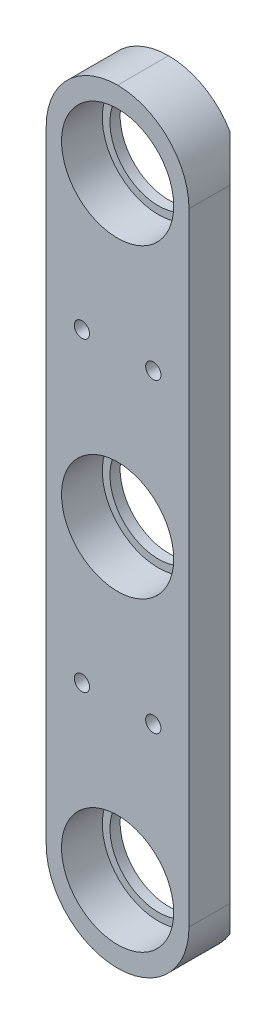
ISO-10303-21;
HEADER;
FILE_DESCRIPTION(('STEP AP214'),'2;1');
FILE_NAME('part.step','',(''),(''),'','','');
FILE_SCHEMA(('AUTOMOTIVE_DESIGN { 1 0 10303 214 1 1 1 1 }'));
ENDSEC;
DATA;
#1=APPLICATION_CONTEXT('core data for automotive mechanical design processes');
#2=APPLICATION_PROTOCOL_DEFINITION('international standard','automotive_design',2000,#1);
#3=PRODUCT_CONTEXT('',#1,'mechanical');
#4=PRODUCT('Part','Part','',(#3));
#5=PRODUCT_RELATED_PRODUCT_CATEGORY('part','',(#4));
#6=PRODUCT_DEFINITION_FORMATION('','',#4);
#7=PRODUCT_DEFINITION_CONTEXT('part definition',#1,'design');
#8=PRODUCT_DEFINITION('design','',#6,#7);
#9=PRODUCT_DEFINITION_SHAPE('','',#8);
#10=(LENGTH_UNIT() NAMED_UNIT(*) SI_UNIT(.MILLI.,.METRE.));
#11=(NAMED_UNIT(*) PLANE_ANGLE_UNIT() SI_UNIT($,.RADIAN.));
#12=(NAMED_UNIT(*) SI_UNIT($,.STERADIAN.) SOLID_ANGLE_UNIT());
#13=UNCERTAINTY_MEASURE_WITH_UNIT(LENGTH_MEASURE(1.E-05),#10,'distance_accuracy_value','');
#14=(GEOMETRIC_REPRESENTATION_CONTEXT(3) GLOBAL_UNCERTAINTY_ASSIGNED_CONTEXT((#13)) GLOBAL_UNIT_ASSIGNED_CONTEXT((#10,
#11,#12)) REPRESENTATION_CONTEXT('',''));
#15=CARTESIAN_POINT('',(0.,0.,0.));
#16=DIRECTION('',(0.,0.,1.));
#17=DIRECTION('',(1.,0.,0.));
#18=AXIS2_PLACEMENT_3D('',#15,#16,#17);
#19=CARTESIAN_POINT('',(0.,0.,10.));
#20=DIRECTION('',(0.,0.,-1.));
#21=DIRECTION('',(-1.,0.,0.));
#22=AXIS2_PLACEMENT_3D('',#19,#20,#21);
#23=PLANE('',#22);
#24=CARTESIAN_POINT('',(-7.,-30.,10.));
#25=DIRECTION('',(0.,0.,1.));
#26=DIRECTION('',(-1.,0.,0.));
#27=AXIS2_PLACEMENT_3D('',#24,#25,#26);
#28=CIRCLE('',#27,1.5);
#29=CARTESIAN_POINT('',(-8.5,-30.,10.));
#30=VERTEX_POINT('',#29);
#31=EDGE_CURVE('E188',#30,#30,#28,.T.);
#32=ORIENTED_EDGE('',*,*,#31,.F.);
#33=EDGE_LOOP('',(#32));
#34=FACE_BOUND('',#33,.T.);
#35=CARTESIAN_POINT('',(7.,-30.,10.));
#36=DIRECTION('',(0.,0.,1.));
#37=DIRECTION('',(1.,0.,0.));
#38=AXIS2_PLACEMENT_3D('',#35,#36,#37);
#39=CIRCLE('',#38,1.5);
#40=CARTESIAN_POINT('',(8.5,-30.,10.));
#41=VERTEX_POINT('',#40);
#42=EDGE_CURVE('E297',#41,#41,#39,.T.);
#43=ORIENTED_EDGE('',*,*,#42,.F.);
#44=EDGE_LOOP('',(#43));
#45=FACE_BOUND('',#44,.T.);
#46=CARTESIAN_POINT('',(7.,30.,10.));
#47=DIRECTION('',(0.,0.,1.));
#48=DIRECTION('',(-1.,0.,0.));
#49=AXIS2_PLACEMENT_3D('',#46,#47,#48);
#50=CIRCLE('',#49,1.5);
#51=CARTESIAN_POINT('',(5.5,30.,10.));
#52=VERTEX_POINT('',#51);
#53=EDGE_CURVE('E295',#52,#52,#50,.T.);
#54=ORIENTED_EDGE('',*,*,#53,.F.);
#55=EDGE_LOOP('',(#54));
#56=FACE_BOUND('',#55,.T.);
#57=CARTESIAN_POINT('',(-7.,30.,10.));
#58=DIRECTION('',(0.,0.,1.));
#59=DIRECTION('',(1.,0.,0.));
#60=AXIS2_PLACEMENT_3D('',#57,#58,#59);
#61=CIRCLE('',#60,1.5);
#62=CARTESIAN_POINT('',(-5.5,30.,10.));
#63=VERTEX_POINT('',#62);
#64=EDGE_CURVE('E176',#63,#63,#61,.T.);
#65=ORIENTED_EDGE('',*,*,#64,.F.);
#66=EDGE_LOOP('',(#65));
#67=FACE_BOUND('',#66,.T.);
#68=DIRECTION('',(0.,1.,0.));
#69=VECTOR('',#68,1.);
#70=CARTESIAN_POINT('',(14.,75.,10.));
#71=LINE('',#70,#69);
#72=CARTESIAN_POINT('',(14.,-61.,10.));
#73=VERTEX_POINT('',#72);
#74=CARTESIAN_POINT('',(14.,61.,10.));
#75=VERTEX_POINT('',#74);
#76=EDGE_CURVE('E150',#73,#75,#71,.T.);
#77=ORIENTED_EDGE('',*,*,#76,.T.);
#78=CARTESIAN_POINT('',(0.,61.,10.));
#79=DIRECTION('',(0.,0.,-1.));
#80=DIRECTION('',(-1.,0.,0.));
#81=AXIS2_PLACEMENT_3D('',#78,#79,#80);
#82=CIRCLE('',#81,14.);
#83=CARTESIAN_POINT('',(0.,75.,10.));
#84=VERTEX_POINT('',#83);
#85=EDGE_CURVE('E142',#75,#84,#82,.F.);
#86=ORIENTED_EDGE('',*,*,#85,.T.);
#87=CARTESIAN_POINT('',(0.,61.,10.));
#88=DIRECTION('',(0.,0.,-1.));
#89=DIRECTION('',(-1.,0.,0.));
#90=AXIS2_PLACEMENT_3D('',#87,#88,#89);
#91=CIRCLE('',#90,14.);
#92=CARTESIAN_POINT('',(-14.,61.,10.));
#93=VERTEX_POINT('',#92);
#94=EDGE_CURVE('E66',#84,#93,#91,.F.);
#95=ORIENTED_EDGE('',*,*,#94,.T.);
#96=DIRECTION('',(0.,-1.,0.));
#97=VECTOR('',#96,1.);
#98=CARTESIAN_POINT('',(-14.,75.,10.));
#99=LINE('',#98,#97);
#100=CARTESIAN_POINT('',(-14.,-61.,10.));
#101=VERTEX_POINT('',#100);
#102=EDGE_CURVE('E217',#93,#101,#99,.T.);
#103=ORIENTED_EDGE('',*,*,#102,.T.);
#104=CARTESIAN_POINT('',(0.,-61.,10.));
#105=DIRECTION('',(0.,0.,-1.));
#106=DIRECTION('',(-1.,0.,0.));
#107=AXIS2_PLACEMENT_3D('',#104,#105,#106);
#108=CIRCLE('',#107,14.);
#109=CARTESIAN_POINT('',(0.,-75.,10.));
#110=VERTEX_POINT('',#109);
#111=EDGE_CURVE('E137',#101,#110,#108,.F.);
#112=ORIENTED_EDGE('',*,*,#111,.T.);
#113=CARTESIAN_POINT('',(0.,-61.,10.));
#114=DIRECTION('',(0.,0.,-1.));
#115=DIRECTION('',(-1.,0.,0.));
#116=AXIS2_PLACEMENT_3D('',#113,#114,#115);
#117=CIRCLE('',#116,14.);
#118=EDGE_CURVE('E138',#110,#73,#117,.F.);
#119=ORIENTED_EDGE('',*,*,#118,.T.);
#120=EDGE_LOOP('',(#77,#86,#95,#103,#112,#119));
#121=FACE_BOUND('',#120,.T.);
#122=CARTESIAN_POINT('',(0.,0.,10.));
#123=DIRECTION('',(0.,0.,1.));
#124=DIRECTION('',(1.,0.,0.));
#125=AXIS2_PLACEMENT_3D('',#122,#123,#124);
#126=CIRCLE('',#125,11.);
#127=CARTESIAN_POINT('',(11.,0.,10.));
#128=VERTEX_POINT('',#127);
#129=EDGE_CURVE('E212',#128,#128,#126,.T.);
#130=ORIENTED_EDGE('',*,*,#129,.F.);
#131=EDGE_LOOP('',(#130));
#132=FACE_BOUND('',#131,.T.);
#133=CARTESIAN_POINT('',(0.,60.,10.));
#134=DIRECTION('',(0.,0.,1.));
#135=DIRECTION('',(1.,0.,0.));
#136=AXIS2_PLACEMENT_3D('',#133,#134,#135);
#137=CIRCLE('',#136,11.);
#138=CARTESIAN_POINT('',(11.,60.,10.));
#139=VERTEX_POINT('',#138);
#140=EDGE_CURVE('E211',#139,#139,#137,.T.);
#141=ORIENTED_EDGE('',*,*,#140,.F.);
#142=EDGE_LOOP('',(#141));
#143=FACE_BOUND('',#142,.T.);
#144=CARTESIAN_POINT('',(4.18977760661176E-13,-60.,10.));
#145=DIRECTION('',(0.,0.,1.));
#146=DIRECTION('',(1.,0.,0.));
#147=AXIS2_PLACEMENT_3D('',#144,#145,#146);
#148=CIRCLE('',#147,11.);
#149=CARTESIAN_POINT('',(11.0000000000004,-60.,10.));
#150=VERTEX_POINT('',#149);
#151=EDGE_CURVE('E204',#150,#150,#148,.T.);
#152=ORIENTED_EDGE('',*,*,#151,.F.);
#153=EDGE_LOOP('',(#152));
#154=FACE_BOUND('',#153,.T.);
#155=ADVANCED_FACE('F43',(#34,#45,#56,#67,#121,#132,#143,#154),#23,.F.);
#156=CARTESIAN_POINT('',(0.,0.,0.));
#157=DIRECTION('',(0.,0.,-1.));
#158=DIRECTION('',(-1.,0.,0.));
#159=AXIS2_PLACEMENT_3D('',#156,#157,#158);
#160=PLANE('',#159);
#161=CARTESIAN_POINT('',(-7.,-30.,0.));
#162=DIRECTION('',(0.,0.,-1.));
#163=DIRECTION('',(-1.,0.,0.));
#164=AXIS2_PLACEMENT_3D('',#161,#162,#163);
#165=CIRCLE('',#164,1.5);
#166=CARTESIAN_POINT('',(-8.5,-30.,0.));
#167=VERTEX_POINT('',#166);
#168=EDGE_CURVE('E302',#167,#167,#165,.F.);
#169=ORIENTED_EDGE('',*,*,#168,.T.);
#170=EDGE_LOOP('',(#169));
#171=FACE_BOUND('',#170,.T.);
#172=CARTESIAN_POINT('',(7.,-30.,0.));
#173=DIRECTION('',(0.,0.,-1.));
#174=DIRECTION('',(-1.,0.,0.));
#175=AXIS2_PLACEMENT_3D('',#172,#173,#174);
#176=CIRCLE('',#175,1.5);
#177=CARTESIAN_POINT('',(5.5,-30.,0.));
#178=VERTEX_POINT('',#177);
#179=EDGE_CURVE('E294',#178,#178,#176,.F.);
#180=ORIENTED_EDGE('',*,*,#179,.T.);
#181=EDGE_LOOP('',(#180));
#182=FACE_BOUND('',#181,.T.);
#183=CARTESIAN_POINT('',(7.,30.,0.));
#184=DIRECTION('',(0.,0.,-1.));
#185=DIRECTION('',(-1.,0.,0.));
#186=AXIS2_PLACEMENT_3D('',#183,#184,#185);
#187=CIRCLE('',#186,1.5);
#188=CARTESIAN_POINT('',(5.5,30.,0.));
#189=VERTEX_POINT('',#188);
#190=EDGE_CURVE('E181',#189,#189,#187,.F.);
#191=ORIENTED_EDGE('',*,*,#190,.T.);
#192=EDGE_LOOP('',(#191));
#193=FACE_BOUND('',#192,.T.);
#194=CARTESIAN_POINT('',(-7.,30.,0.));
#195=DIRECTION('',(0.,0.,-1.));
#196=DIRECTION('',(-1.,0.,0.));
#197=AXIS2_PLACEMENT_3D('',#194,#195,#196);
#198=CIRCLE('',#197,1.5);
#199=CARTESIAN_POINT('',(-8.5,30.,0.));
#200=VERTEX_POINT('',#199);
#201=EDGE_CURVE('E179',#200,#200,#198,.F.);
#202=ORIENTED_EDGE('',*,*,#201,.T.);
#203=EDGE_LOOP('',(#202));
#204=FACE_BOUND('',#203,.T.);
#205=CARTESIAN_POINT('',(0.,61.,0.));
#206=DIRECTION('',(0.,0.,-1.));
#207=DIRECTION('',(-1.,0.,0.));
#208=AXIS2_PLACEMENT_3D('',#205,#206,#207);
#209=CIRCLE('',#208,14.);
#210=CARTESIAN_POINT('',(-14.,61.,0.));
#211=VERTEX_POINT('',#210);
#212=CARTESIAN_POINT('',(0.,75.,0.));
#213=VERTEX_POINT('',#212);
#214=EDGE_CURVE('E103',#211,#213,#209,.T.);
#215=ORIENTED_EDGE('',*,*,#214,.T.);
#216=CARTESIAN_POINT('',(0.,61.,0.));
#217=DIRECTION('',(0.,0.,-1.));
#218=DIRECTION('',(-1.,0.,0.));
#219=AXIS2_PLACEMENT_3D('',#216,#217,#218);
#220=CIRCLE('',#219,14.);
#221=CARTESIAN_POINT('',(12.,68.211102550928,0.));
#222=VERTEX_POINT('',#221);
#223=EDGE_CURVE('E108',#213,#222,#220,.T.);
#224=ORIENTED_EDGE('',*,*,#223,.T.);
#225=DIRECTION('',(0.,-1.,0.));
#226=VECTOR('',#225,1.);
#227=CARTESIAN_POINT('',(12.,-75.,0.));
#228=LINE('',#227,#226);
#229=CARTESIAN_POINT('',(12.,-68.211102550928,0.));
#230=VERTEX_POINT('',#229);
#231=EDGE_CURVE('E154',#222,#230,#228,.T.);
#232=ORIENTED_EDGE('',*,*,#231,.T.);
#233=CARTESIAN_POINT('',(0.,-61.,0.));
#234=DIRECTION('',(0.,0.,-1.));
#235=DIRECTION('',(-1.,0.,0.));
#236=AXIS2_PLACEMENT_3D('',#233,#234,#235);
#237=CIRCLE('',#236,14.);
#238=CARTESIAN_POINT('',(0.,-75.,0.));
#239=VERTEX_POINT('',#238);
#240=EDGE_CURVE('E111',#230,#239,#237,.T.);
#241=ORIENTED_EDGE('',*,*,#240,.T.);
#242=CARTESIAN_POINT('',(0.,-61.,0.));
#243=DIRECTION('',(0.,0.,-1.));
#244=DIRECTION('',(-1.,0.,0.));
#245=AXIS2_PLACEMENT_3D('',#242,#243,#244);
#246=CIRCLE('',#245,14.);
#247=CARTESIAN_POINT('',(-14.,-61.,0.));
#248=VERTEX_POINT('',#247);
#249=EDGE_CURVE('E158',#239,#248,#246,.T.);
#250=ORIENTED_EDGE('',*,*,#249,.T.);
#251=DIRECTION('',(0.,-1.,0.));
#252=VECTOR('',#251,1.);
#253=CARTESIAN_POINT('',(-14.,75.,0.));
#254=LINE('',#253,#252);
#255=EDGE_CURVE('E112',#211,#248,#254,.T.);
#256=ORIENTED_EDGE('',*,*,#255,.F.);
#257=EDGE_LOOP('',(#215,#224,#232,#241,#250,#256));
#258=FACE_BOUND('',#257,.T.);
#259=CARTESIAN_POINT('',(4.18977760661176E-13,-60.,0.));
#260=DIRECTION('',(0.,0.,1.));
#261=DIRECTION('',(1.,0.,0.));
#262=AXIS2_PLACEMENT_3D('',#259,#260,#261);
#263=CIRCLE('',#262,9.5);
#264=CARTESIAN_POINT('',(9.50000000000042,-60.,0.));
#265=VERTEX_POINT('',#264);
#266=EDGE_CURVE('E116',#265,#265,#263,.T.);
#267=ORIENTED_EDGE('',*,*,#266,.T.);
#268=EDGE_LOOP('',(#267));
#269=FACE_BOUND('',#268,.T.);
#270=CARTESIAN_POINT('',(0.,60.,0.));
#271=DIRECTION('',(0.,0.,1.));
#272=DIRECTION('',(1.,0.,0.));
#273=AXIS2_PLACEMENT_3D('',#270,#271,#272);
#274=CIRCLE('',#273,9.5);
#275=CARTESIAN_POINT('',(9.5,60.,0.));
#276=VERTEX_POINT('',#275);
#277=EDGE_CURVE('E192',#276,#276,#274,.T.);
#278=ORIENTED_EDGE('',*,*,#277,.T.);
#279=EDGE_LOOP('',(#278));
#280=FACE_BOUND('',#279,.T.);
#281=CARTESIAN_POINT('',(0.,0.,0.));
#282=DIRECTION('',(0.,0.,1.));
#283=DIRECTION('',(1.,0.,0.));
#284=AXIS2_PLACEMENT_3D('',#281,#282,#283);
#285=CIRCLE('',#284,9.5);
#286=CARTESIAN_POINT('',(9.5,0.,0.));
#287=VERTEX_POINT('',#286);
#288=EDGE_CURVE('E196',#287,#287,#285,.T.);
#289=ORIENTED_EDGE('',*,*,#288,.T.);
#290=EDGE_LOOP('',(#289));
#291=FACE_BOUND('',#290,.T.);
#292=ADVANCED_FACE('F104',(#171,#182,#193,#204,#258,#269,#280,#291),#160,.T.);
#293=CARTESIAN_POINT('',(14.,75.,10.));
#294=DIRECTION('',(-1.,0.,0.));
#295=DIRECTION('',(0.,0.,1.));
#296=AXIS2_PLACEMENT_3D('',#293,#294,#295);
#297=PLANE('',#296);
#298=DIRECTION('',(0.,1.,0.));
#299=VECTOR('',#298,1.);
#300=CARTESIAN_POINT('',(14.,75.,2.));
#301=LINE('',#300,#299);
#302=CARTESIAN_POINT('',(14.,-61.,2.));
#303=VERTEX_POINT('',#302);
#304=CARTESIAN_POINT('',(14.,61.,2.));
#305=VERTEX_POINT('',#304);
#306=EDGE_CURVE('E153',#303,#305,#301,.T.);
#307=ORIENTED_EDGE('',*,*,#306,.T.);
#308=DIRECTION('',(0.,0.,-1.));
#309=VECTOR('',#308,1.);
#310=CARTESIAN_POINT('',(14.,61.,10.));
#311=LINE('',#310,#309);
#312=EDGE_CURVE('E135',#305,#75,#311,.F.);
#313=ORIENTED_EDGE('',*,*,#312,.T.);
#314=ORIENTED_EDGE('',*,*,#76,.F.);
#315=DIRECTION('',(0.,0.,-1.));
#316=VECTOR('',#315,1.);
#317=CARTESIAN_POINT('',(14.,-61.,10.));
#318=LINE('',#317,#316);
#319=EDGE_CURVE('E133',#73,#303,#318,.T.);
#320=ORIENTED_EDGE('',*,*,#319,.T.);
#321=EDGE_LOOP('',(#307,#313,#314,#320));
#322=FACE_BOUND('',#321,.T.);
#323=ADVANCED_FACE('F147',(#322),#297,.F.);
#324=CARTESIAN_POINT('',(-14.,75.,10.));
#325=DIRECTION('',(1.,0.,0.));
#326=DIRECTION('',(0.,0.,-1.));
#327=AXIS2_PLACEMENT_3D('',#324,#325,#326);
#328=PLANE('',#327);
#329=ORIENTED_EDGE('',*,*,#102,.F.);
#330=DIRECTION('',(0.,0.,-1.));
#331=VECTOR('',#330,1.);
#332=CARTESIAN_POINT('',(-14.,61.,10.));
#333=LINE('',#332,#331);
#334=EDGE_CURVE('E11',#93,#211,#333,.T.);
#335=ORIENTED_EDGE('',*,*,#334,.T.);
#336=ORIENTED_EDGE('',*,*,#255,.T.);
#337=DIRECTION('',(0.,0.,-1.));
#338=VECTOR('',#337,1.);
#339=CARTESIAN_POINT('',(-14.,-61.,10.));
#340=LINE('',#339,#338);
#341=EDGE_CURVE('E55',#248,#101,#340,.F.);
#342=ORIENTED_EDGE('',*,*,#341,.T.);
#343=EDGE_LOOP('',(#329,#335,#336,#342));
#344=FACE_BOUND('',#343,.T.);
#345=ADVANCED_FACE('F218',(#344),#328,.F.);
#346=CARTESIAN_POINT('',(0.,0.,10.));
#347=DIRECTION('',(0.,0.,-1.));
#348=DIRECTION('',(-1.,0.,0.));
#349=AXIS2_PLACEMENT_3D('',#346,#347,#348);
#350=CYLINDRICAL_SURFACE('',#349,11.);
#351=CARTESIAN_POINT('',(0.,0.,2.));
#352=DIRECTION('',(0.,0.,1.));
#353=DIRECTION('',(1.,0.,0.));
#354=AXIS2_PLACEMENT_3D('',#351,#352,#353);
#355=CIRCLE('',#354,11.);
#356=CARTESIAN_POINT('',(11.,0.,2.));
#357=VERTEX_POINT('',#356);
#358=EDGE_CURVE('E156',#357,#357,#355,.T.);
#359=ORIENTED_EDGE('',*,*,#358,.F.);
#360=EDGE_LOOP('',(#359));
#361=FACE_BOUND('',#360,.T.);
#362=ORIENTED_EDGE('',*,*,#129,.T.);
#363=EDGE_LOOP('',(#362));
#364=FACE_BOUND('',#363,.T.);
#365=ADVANCED_FACE('F222',(#361,#364),#350,.F.);
#366=CARTESIAN_POINT('',(0.,60.,10.));
#367=DIRECTION('',(0.,0.,-1.));
#368=DIRECTION('',(-1.,0.,0.));
#369=AXIS2_PLACEMENT_3D('',#366,#367,#368);
#370=CYLINDRICAL_SURFACE('',#369,11.);
#371=CARTESIAN_POINT('',(0.,60.,2.));
#372=DIRECTION('',(0.,0.,1.));
#373=DIRECTION('',(1.,0.,0.));
#374=AXIS2_PLACEMENT_3D('',#371,#372,#373);
#375=CIRCLE('',#374,11.);
#376=CARTESIAN_POINT('',(11.,60.,2.));
#377=VERTEX_POINT('',#376);
#378=EDGE_CURVE('E161',#377,#377,#375,.T.);
#379=ORIENTED_EDGE('',*,*,#378,.F.);
#380=EDGE_LOOP('',(#379));
#381=FACE_BOUND('',#380,.T.);
#382=ORIENTED_EDGE('',*,*,#140,.T.);
#383=EDGE_LOOP('',(#382));
#384=FACE_BOUND('',#383,.T.);
#385=ADVANCED_FACE('F227',(#381,#384),#370,.F.);
#386=CARTESIAN_POINT('',(4.18977760661176E-13,-60.,10.));
#387=DIRECTION('',(0.,0.,-1.));
#388=DIRECTION('',(-1.,0.,0.));
#389=AXIS2_PLACEMENT_3D('',#386,#387,#388);
#390=CYLINDRICAL_SURFACE('',#389,11.);
#391=CARTESIAN_POINT('',(4.18977760661176E-13,-60.,2.));
#392=DIRECTION('',(0.,0.,1.));
#393=DIRECTION('',(1.,0.,0.));
#394=AXIS2_PLACEMENT_3D('',#391,#392,#393);
#395=CIRCLE('',#394,11.);
#396=CARTESIAN_POINT('',(11.0000000000004,-60.,2.));
#397=VERTEX_POINT('',#396);
#398=EDGE_CURVE('E163',#397,#397,#395,.T.);
#399=ORIENTED_EDGE('',*,*,#398,.F.);
#400=EDGE_LOOP('',(#399));
#401=FACE_BOUND('',#400,.T.);
#402=ORIENTED_EDGE('',*,*,#151,.T.);
#403=EDGE_LOOP('',(#402));
#404=FACE_BOUND('',#403,.T.);
#405=ADVANCED_FACE('F246',(#401,#404),#390,.F.);
#406=CARTESIAN_POINT('',(0.,0.,2.));
#407=DIRECTION('',(0.,0.,1.));
#408=DIRECTION('',(1.,0.,0.));
#409=AXIS2_PLACEMENT_3D('',#406,#407,#408);
#410=PLANE('',#409);
#411=CARTESIAN_POINT('',(4.18977760661176E-13,-60.,2.));
#412=DIRECTION('',(0.,0.,1.));
#413=DIRECTION('',(1.,0.,0.));
#414=AXIS2_PLACEMENT_3D('',#411,#412,#413);
#415=CIRCLE('',#414,9.5);
#416=CARTESIAN_POINT('',(9.50000000000042,-60.,2.));
#417=VERTEX_POINT('',#416);
#418=EDGE_CURVE('E190',#417,#417,#415,.T.);
#419=ORIENTED_EDGE('',*,*,#418,.F.);
#420=EDGE_LOOP('',(#419));
#421=FACE_BOUND('',#420,.T.);
#422=ORIENTED_EDGE('',*,*,#398,.T.);
#423=EDGE_LOOP('',(#422));
#424=FACE_BOUND('',#423,.T.);
#425=ADVANCED_FACE('F250',(#421,#424),#410,.T.);
#426=CARTESIAN_POINT('',(4.18977760661176E-13,-60.,2.));
#427=DIRECTION('',(0.,0.,-1.));
#428=DIRECTION('',(-1.,0.,0.));
#429=AXIS2_PLACEMENT_3D('',#426,#427,#428);
#430=CYLINDRICAL_SURFACE('',#429,9.5);
#431=ORIENTED_EDGE('',*,*,#418,.T.);
#432=EDGE_LOOP('',(#431));
#433=FACE_BOUND('',#432,.T.);
#434=ORIENTED_EDGE('',*,*,#266,.F.);
#435=EDGE_LOOP('',(#434));
#436=FACE_BOUND('',#435,.T.);
#437=ADVANCED_FACE('F266',(#433,#436),#430,.F.);
#438=CARTESIAN_POINT('',(0.,60.,2.));
#439=DIRECTION('',(0.,0.,1.));
#440=DIRECTION('',(1.,0.,0.));
#441=AXIS2_PLACEMENT_3D('',#438,#439,#440);
#442=CIRCLE('',#441,9.5);
#443=CARTESIAN_POINT('',(9.5,60.,2.));
#444=VERTEX_POINT('',#443);
#445=EDGE_CURVE('E195',#444,#444,#442,.T.);
#446=ORIENTED_EDGE('',*,*,#445,.F.);
#447=EDGE_LOOP('',(#446));
#448=FACE_BOUND('',#447,.T.);
#449=ORIENTED_EDGE('',*,*,#378,.T.);
#450=EDGE_LOOP('',(#449));
#451=FACE_BOUND('',#450,.T.);
#452=ADVANCED_FACE('F256',(#448,#451),#410,.T.);
#453=CARTESIAN_POINT('',(0.,60.,2.));
#454=DIRECTION('',(0.,0.,-1.));
#455=DIRECTION('',(-1.,0.,0.));
#456=AXIS2_PLACEMENT_3D('',#453,#454,#455);
#457=CYLINDRICAL_SURFACE('',#456,9.5);
#458=ORIENTED_EDGE('',*,*,#445,.T.);
#459=EDGE_LOOP('',(#458));
#460=FACE_BOUND('',#459,.T.);
#461=ORIENTED_EDGE('',*,*,#277,.F.);
#462=EDGE_LOOP('',(#461));
#463=FACE_BOUND('',#462,.T.);
#464=ADVANCED_FACE('F258',(#460,#463),#457,.F.);
#465=CARTESIAN_POINT('',(0.,0.,2.));
#466=DIRECTION('',(0.,0.,1.));
#467=DIRECTION('',(1.,0.,0.));
#468=AXIS2_PLACEMENT_3D('',#465,#466,#467);
#469=CIRCLE('',#468,9.5);
#470=CARTESIAN_POINT('',(9.5,0.,2.));
#471=VERTEX_POINT('',#470);
#472=EDGE_CURVE('E203',#471,#471,#469,.T.);
#473=ORIENTED_EDGE('',*,*,#472,.F.);
#474=EDGE_LOOP('',(#473));
#475=FACE_BOUND('',#474,.T.);
#476=ORIENTED_EDGE('',*,*,#358,.T.);
#477=EDGE_LOOP('',(#476));
#478=FACE_BOUND('',#477,.T.);
#479=ADVANCED_FACE('F252',(#475,#478),#410,.T.);
#480=CARTESIAN_POINT('',(0.,0.,2.));
#481=DIRECTION('',(0.,0.,-1.));
#482=DIRECTION('',(-1.,0.,0.));
#483=AXIS2_PLACEMENT_3D('',#480,#481,#482);
#484=CYLINDRICAL_SURFACE('',#483,9.5);
#485=ORIENTED_EDGE('',*,*,#472,.T.);
#486=EDGE_LOOP('',(#485));
#487=FACE_BOUND('',#486,.T.);
#488=ORIENTED_EDGE('',*,*,#288,.F.);
#489=EDGE_LOOP('',(#488));
#490=FACE_BOUND('',#489,.T.);
#491=ADVANCED_FACE('F254',(#487,#490),#484,.F.);
#492=CARTESIAN_POINT('',(14.,75.,2.));
#493=DIRECTION('',(0.707106781186545,0.,-0.70710678118655));
#494=DIRECTION('',(0.,-1.,0.));
#495=AXIS2_PLACEMENT_3D('',#492,#493,#494);
#496=PLANE('',#495);
#497=ORIENTED_EDGE('',*,*,#231,.F.);
#498=CARTESIAN_POINT('',(0.,61.,-11.9999999999999));
#499=DIRECTION('',(0.707106781186545,0.,-0.70710678118655));
#500=DIRECTION('',(-0.70710678118655,0.,-0.707106781186545));
#501=AXIS2_PLACEMENT_3D('',#498,#499,#500);
#502=ELLIPSE('',#501,19.7989898732233,14.);
#503=EDGE_CURVE('E123',#222,#305,#502,.T.);
#504=ORIENTED_EDGE('',*,*,#503,.T.);
#505=ORIENTED_EDGE('',*,*,#306,.F.);
#506=CARTESIAN_POINT('',(0.,-61.,-11.9999999999999));
#507=DIRECTION('',(0.707106781186545,0.,-0.70710678118655));
#508=DIRECTION('',(-0.70710678118655,0.,-0.707106781186545));
#509=AXIS2_PLACEMENT_3D('',#506,#507,#508);
#510=ELLIPSE('',#509,19.7989898732233,14.);
#511=EDGE_CURVE('E125',#303,#230,#510,.T.);
#512=ORIENTED_EDGE('',*,*,#511,.T.);
#513=EDGE_LOOP('',(#497,#504,#505,#512));
#514=FACE_BOUND('',#513,.T.);
#515=ADVANCED_FACE('F261',(#514),#496,.T.);
#516=CARTESIAN_POINT('',(0.,61.,10.));
#517=DIRECTION('',(0.,0.,-1.));
#518=DIRECTION('',(-1.,0.,0.));
#519=AXIS2_PLACEMENT_3D('',#516,#517,#518);
#520=CYLINDRICAL_SURFACE('',#519,14.);
#521=ORIENTED_EDGE('',*,*,#334,.F.);
#522=ORIENTED_EDGE('',*,*,#94,.F.);
#523=DIRECTION('',(0.,0.,-1.));
#524=VECTOR('',#523,1.);
#525=CARTESIAN_POINT('',(0.,75.,10.));
#526=LINE('',#525,#524);
#527=EDGE_CURVE('E119',#213,#84,#526,.F.);
#528=ORIENTED_EDGE('',*,*,#527,.F.);
#529=ORIENTED_EDGE('',*,*,#214,.F.);
#530=EDGE_LOOP('',(#521,#522,#528,#529));
#531=FACE_BOUND('',#530,.T.);
#532=ADVANCED_FACE('F117',(#531),#520,.T.);
#533=CARTESIAN_POINT('',(0.,61.,10.));
#534=DIRECTION('',(0.,0.,-1.));
#535=DIRECTION('',(-1.,0.,0.));
#536=AXIS2_PLACEMENT_3D('',#533,#534,#535);
#537=CYLINDRICAL_SURFACE('',#536,14.);
#538=ORIENTED_EDGE('',*,*,#85,.F.);
#539=ORIENTED_EDGE('',*,*,#312,.F.);
#540=ORIENTED_EDGE('',*,*,#503,.F.);
#541=ORIENTED_EDGE('',*,*,#223,.F.);
#542=ORIENTED_EDGE('',*,*,#527,.T.);
#543=EDGE_LOOP('',(#538,#539,#540,#541,#542));
#544=FACE_BOUND('',#543,.T.);
#545=ADVANCED_FACE('F122',(#544),#537,.T.);
#546=CARTESIAN_POINT('',(0.,-61.,10.));
#547=DIRECTION('',(0.,0.,-1.));
#548=DIRECTION('',(-1.,0.,0.));
#549=AXIS2_PLACEMENT_3D('',#546,#547,#548);
#550=CYLINDRICAL_SURFACE('',#549,14.);
#551=DIRECTION('',(0.,0.,-1.));
#552=VECTOR('',#551,1.);
#553=CARTESIAN_POINT('',(0.,-75.,10.));
#554=LINE('',#553,#552);
#555=EDGE_CURVE('E50',#110,#239,#554,.T.);
#556=ORIENTED_EDGE('',*,*,#555,.F.);
#557=ORIENTED_EDGE('',*,*,#111,.F.);
#558=ORIENTED_EDGE('',*,*,#341,.F.);
#559=ORIENTED_EDGE('',*,*,#249,.F.);
#560=EDGE_LOOP('',(#556,#557,#558,#559));
#561=FACE_BOUND('',#560,.T.);
#562=ADVANCED_FACE('F44',(#561),#550,.T.);
#563=CARTESIAN_POINT('',(0.,-61.,10.));
#564=DIRECTION('',(0.,0.,-1.));
#565=DIRECTION('',(-1.,0.,0.));
#566=AXIS2_PLACEMENT_3D('',#563,#564,#565);
#567=CYLINDRICAL_SURFACE('',#566,14.);
#568=ORIENTED_EDGE('',*,*,#118,.F.);
#569=ORIENTED_EDGE('',*,*,#555,.T.);
#570=ORIENTED_EDGE('',*,*,#240,.F.);
#571=ORIENTED_EDGE('',*,*,#511,.F.);
#572=ORIENTED_EDGE('',*,*,#319,.F.);
#573=EDGE_LOOP('',(#568,#569,#570,#571,#572));
#574=FACE_BOUND('',#573,.T.);
#575=ADVANCED_FACE('F171',(#574),#567,.T.);
#576=CARTESIAN_POINT('',(-7.,30.,-0.000999999999999265));
#577=DIRECTION('',(0.,0.,1.));
#578=DIRECTION('',(1.,0.,0.));
#579=AXIS2_PLACEMENT_3D('',#576,#577,#578);
#580=CYLINDRICAL_SURFACE('',#579,1.5);
#581=ORIENTED_EDGE('',*,*,#201,.F.);
#582=EDGE_LOOP('',(#581));
#583=FACE_BOUND('',#582,.T.);
#584=ORIENTED_EDGE('',*,*,#64,.T.);
#585=EDGE_LOOP('',(#584));
#586=FACE_BOUND('',#585,.T.);
#587=ADVANCED_FACE('F269',(#583,#586),#580,.F.);
#588=CARTESIAN_POINT('',(7.,30.,-0.000999999999999265));
#589=DIRECTION('',(0.,0.,1.));
#590=DIRECTION('',(1.,0.,0.));
#591=AXIS2_PLACEMENT_3D('',#588,#589,#590);
#592=CYLINDRICAL_SURFACE('',#591,1.5);
#593=ORIENTED_EDGE('',*,*,#190,.F.);
#594=EDGE_LOOP('',(#593));
#595=FACE_BOUND('',#594,.T.);
#596=ORIENTED_EDGE('',*,*,#53,.T.);
#597=EDGE_LOOP('',(#596));
#598=FACE_BOUND('',#597,.T.);
#599=ADVANCED_FACE('F272',(#595,#598),#592,.F.);
#600=CARTESIAN_POINT('',(7.,-30.,-0.000999999999999265));
#601=DIRECTION('',(0.,0.,1.));
#602=DIRECTION('',(1.,0.,0.));
#603=AXIS2_PLACEMENT_3D('',#600,#601,#602);
#604=CYLINDRICAL_SURFACE('',#603,1.5);
#605=ORIENTED_EDGE('',*,*,#179,.F.);
#606=EDGE_LOOP('',(#605));
#607=FACE_BOUND('',#606,.T.);
#608=ORIENTED_EDGE('',*,*,#42,.T.);
#609=EDGE_LOOP('',(#608));
#610=FACE_BOUND('',#609,.T.);
#611=ADVANCED_FACE('F279',(#607,#610),#604,.F.);
#612=CARTESIAN_POINT('',(-7.,-30.,-0.000999999999999265));
#613=DIRECTION('',(0.,0.,1.));
#614=DIRECTION('',(1.,0.,0.));
#615=AXIS2_PLACEMENT_3D('',#612,#613,#614);
#616=CYLINDRICAL_SURFACE('',#615,1.5);
#617=ORIENTED_EDGE('',*,*,#168,.F.);
#618=EDGE_LOOP('',(#617));
#619=FACE_BOUND('',#618,.T.);
#620=ORIENTED_EDGE('',*,*,#31,.T.);
#621=EDGE_LOOP('',(#620));
#622=FACE_BOUND('',#621,.T.);
#623=ADVANCED_FACE('F274',(#619,#622),#616,.F.);
#624=CLOSED_SHELL('',(#155,#292,#323,#345,#365,#385,#405,#425,#437,#452,#464,#479,#491,#515,
#532,#545,#562,#575,#587,#599,#611,#623));
#625=MANIFOLD_SOLID_BREP('B2',#624);
#626=ADVANCED_BREP_SHAPE_REPRESENTATION('',(#18,#625),#14);
#627=SHAPE_DEFINITION_REPRESENTATION(#9,#626);
ENDSEC;
END-ISO-10303-21;
